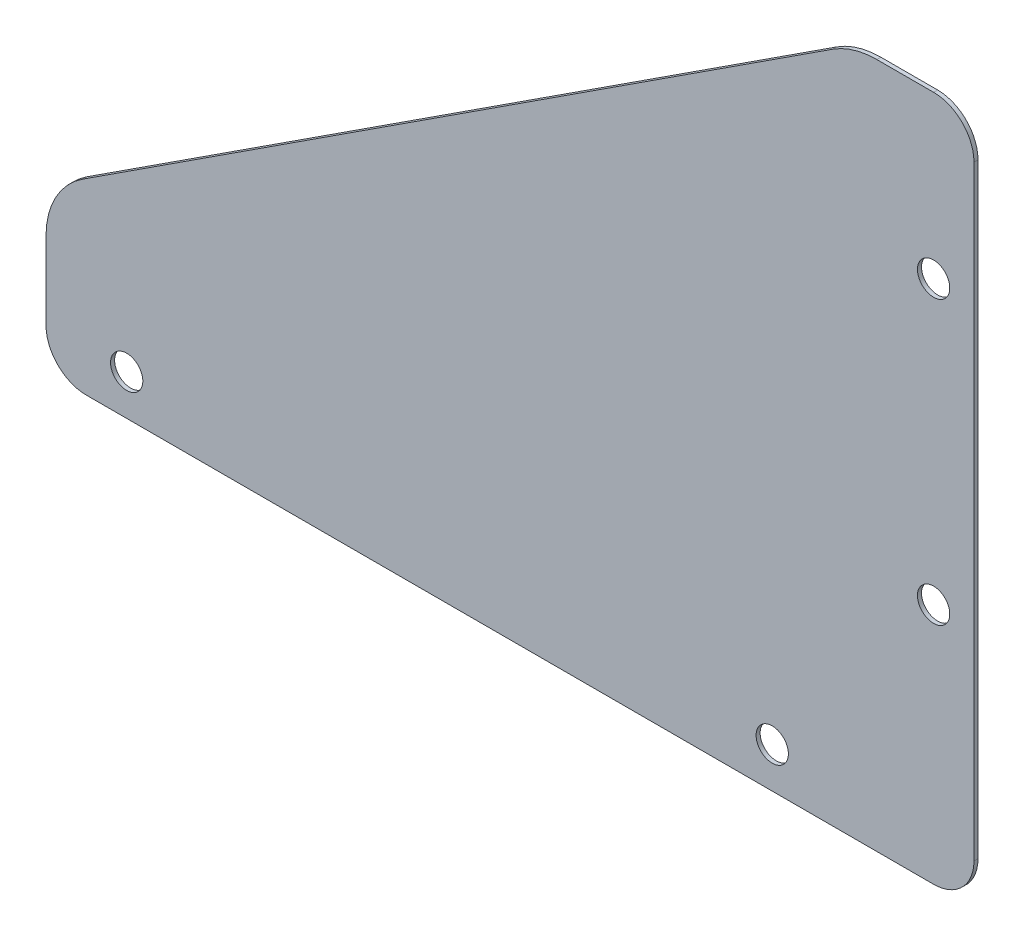
ISO-10303-21;
HEADER;
FILE_DESCRIPTION(('STEP AP214'),'2;1');
FILE_NAME('part.step','',(''),(''),'','','');
FILE_SCHEMA(('AUTOMOTIVE_DESIGN { 1 0 10303 214 1 1 1 1 }'));
ENDSEC;
DATA;
#1=APPLICATION_CONTEXT('core data for automotive mechanical design processes');
#2=APPLICATION_PROTOCOL_DEFINITION('international standard','automotive_design',2000,#1);
#3=PRODUCT_CONTEXT('',#1,'mechanical');
#4=PRODUCT('Part','Part','',(#3));
#5=PRODUCT_RELATED_PRODUCT_CATEGORY('part','',(#4));
#6=PRODUCT_DEFINITION_FORMATION('','',#4);
#7=PRODUCT_DEFINITION_CONTEXT('part definition',#1,'design');
#8=PRODUCT_DEFINITION('design','',#6,#7);
#9=PRODUCT_DEFINITION_SHAPE('','',#8);
#10=(LENGTH_UNIT() NAMED_UNIT(*) SI_UNIT(.MILLI.,.METRE.));
#11=(NAMED_UNIT(*) PLANE_ANGLE_UNIT() SI_UNIT($,.RADIAN.));
#12=(NAMED_UNIT(*) SI_UNIT($,.STERADIAN.) SOLID_ANGLE_UNIT());
#13=UNCERTAINTY_MEASURE_WITH_UNIT(LENGTH_MEASURE(1.E-05),#10,'distance_accuracy_value','');
#14=(GEOMETRIC_REPRESENTATION_CONTEXT(3) GLOBAL_UNCERTAINTY_ASSIGNED_CONTEXT((#13)) GLOBAL_UNIT_ASSIGNED_CONTEXT((#10,
#11,#12)) REPRESENTATION_CONTEXT('',''));
#15=CARTESIAN_POINT('',(0.,0.,0.));
#16=DIRECTION('',(0.,0.,1.));
#17=DIRECTION('',(1.,0.,0.));
#18=AXIS2_PLACEMENT_3D('',#15,#16,#17);
#19=CARTESIAN_POINT('',(-105.,14.5731395581234,0.5));
#20=DIRECTION('',(0.,0.,1.));
#21=DIRECTION('',(1.,0.,0.));
#22=AXIS2_PLACEMENT_3D('',#19,#20,#21);
#23=PLANE('',#22);
#24=CARTESIAN_POINT('',(-25.,5.,0.5));
#25=DIRECTION('',(0.,0.,1.));
#26=DIRECTION('',(1.,0.,0.));
#27=AXIS2_PLACEMENT_3D('',#24,#25,#26);
#28=CIRCLE('',#27,2.);
#29=CARTESIAN_POINT('',(-23.,5.,0.5));
#30=VERTEX_POINT('',#29);
#31=EDGE_CURVE('E220',#30,#30,#28,.T.);
#32=ORIENTED_EDGE('',*,*,#31,.F.);
#33=EDGE_LOOP('',(#32));
#34=FACE_BOUND('',#33,.T.);
#35=CARTESIAN_POINT('',(-105.,5.,0.5));
#36=DIRECTION('',(0.,0.,1.));
#37=DIRECTION('',(1.,0.,0.));
#38=AXIS2_PLACEMENT_3D('',#35,#36,#37);
#39=CIRCLE('',#38,2.);
#40=CARTESIAN_POINT('',(-103.,5.,0.5));
#41=VERTEX_POINT('',#40);
#42=EDGE_CURVE('E148',#41,#41,#39,.T.);
#43=ORIENTED_EDGE('',*,*,#42,.F.);
#44=EDGE_LOOP('',(#43));
#45=FACE_BOUND('',#44,.T.);
#46=CARTESIAN_POINT('',(-105.,14.5731395581234,0.5));
#47=DIRECTION('',(0.,0.,1.));
#48=DIRECTION('',(1.,0.,0.));
#49=AXIS2_PLACEMENT_3D('',#46,#47,#48);
#50=CIRCLE('',#49,9.99999999999999);
#51=CARTESIAN_POINT('',(-110.449883505954,22.9575757211298,0.5));
#52=VERTEX_POINT('',#51);
#53=CARTESIAN_POINT('',(-115.,14.5731395581234,0.5));
#54=VERTEX_POINT('',#53);
#55=EDGE_CURVE('E163',#52,#54,#50,.T.);
#56=ORIENTED_EDGE('',*,*,#55,.T.);
#57=DIRECTION('',(0.,-1.,0.));
#58=VECTOR('',#57,1.);
#59=CARTESIAN_POINT('',(-115.,14.5731395581234,0.5));
#60=LINE('',#59,#58);
#61=CARTESIAN_POINT('',(-115.,5.00000000000004,0.5));
#62=VERTEX_POINT('',#61);
#63=EDGE_CURVE('E101',#54,#62,#60,.T.);
#64=ORIENTED_EDGE('',*,*,#63,.T.);
#65=CARTESIAN_POINT('',(-110.,5.,0.5));
#66=DIRECTION('',(0.,0.,1.));
#67=DIRECTION('',(1.,0.,0.));
#68=AXIS2_PLACEMENT_3D('',#65,#66,#67);
#69=CIRCLE('',#68,5.);
#70=CARTESIAN_POINT('',(-110.,0.,0.5));
#71=VERTEX_POINT('',#70);
#72=EDGE_CURVE('E184',#62,#71,#69,.T.);
#73=ORIENTED_EDGE('',*,*,#72,.T.);
#74=DIRECTION('',(1.,0.,0.));
#75=VECTOR('',#74,1.);
#76=CARTESIAN_POINT('',(-110.,0.,0.5));
#77=LINE('',#76,#75);
#78=CARTESIAN_POINT('',(-5.00000000000003,0.,0.5));
#79=VERTEX_POINT('',#78);
#80=EDGE_CURVE('E203',#71,#79,#77,.T.);
#81=ORIENTED_EDGE('',*,*,#80,.T.);
#82=CARTESIAN_POINT('',(-5.,5.,0.5));
#83=DIRECTION('',(0.,0.,1.));
#84=DIRECTION('',(-1.,0.,0.));
#85=AXIS2_PLACEMENT_3D('',#82,#83,#84);
#86=CIRCLE('',#85,5.);
#87=CARTESIAN_POINT('',(0.,5.00000000000004,0.5));
#88=VERTEX_POINT('',#87);
#89=EDGE_CURVE('E200',#79,#88,#86,.T.);
#90=ORIENTED_EDGE('',*,*,#89,.T.);
#91=DIRECTION('',(0.,1.,0.));
#92=VECTOR('',#91,1.);
#93=CARTESIAN_POINT('',(0.,5.00000000000004,0.5));
#94=LINE('',#93,#92);
#95=CARTESIAN_POINT('',(0.,80.,0.5));
#96=VERTEX_POINT('',#95);
#97=EDGE_CURVE('E202',#88,#96,#94,.T.);
#98=ORIENTED_EDGE('',*,*,#97,.T.);
#99=CARTESIAN_POINT('',(-5.,80.,0.5));
#100=DIRECTION('',(0.,0.,1.));
#101=DIRECTION('',(1.,0.,0.));
#102=AXIS2_PLACEMENT_3D('',#99,#100,#101);
#103=CIRCLE('',#102,5.);
#104=CARTESIAN_POINT('',(-5.00000000000004,85.,0.5));
#105=VERTEX_POINT('',#104);
#106=EDGE_CURVE('E126',#96,#105,#103,.T.);
#107=ORIENTED_EDGE('',*,*,#106,.T.);
#108=DIRECTION('',(-1.,0.,0.));
#109=VECTOR('',#108,1.);
#110=CARTESIAN_POINT('',(-5.00000000000004,85.,0.5));
#111=LINE('',#110,#109);
#112=CARTESIAN_POINT('',(-12.0355993201899,85.,0.5));
#113=VERTEX_POINT('',#112);
#114=EDGE_CURVE('E120',#105,#113,#111,.T.);
#115=ORIENTED_EDGE('',*,*,#114,.T.);
#116=CARTESIAN_POINT('',(-12.0355993201899,75.,0.5));
#117=DIRECTION('',(0.,0.,1.));
#118=DIRECTION('',(1.,0.,0.));
#119=AXIS2_PLACEMENT_3D('',#116,#117,#118);
#120=CIRCLE('',#119,9.99999999999999);
#121=CARTESIAN_POINT('',(-17.4854828261441,83.3844361630064,0.5));
#122=VERTEX_POINT('',#121);
#123=EDGE_CURVE('E124',#113,#122,#120,.T.);
#124=ORIENTED_EDGE('',*,*,#123,.T.);
#125=DIRECTION('',(-0.838443616300637,-0.544988350595414,0.));
#126=VECTOR('',#125,1.);
#127=CARTESIAN_POINT('',(-17.4854828261441,83.3844361630064,0.5));
#128=LINE('',#127,#126);
#129=EDGE_CURVE('E52',#122,#52,#128,.T.);
#130=ORIENTED_EDGE('',*,*,#129,.T.);
#131=EDGE_LOOP('',(#56,#64,#73,#81,#90,#98,#107,#115,#124,#130));
#132=FACE_BOUND('',#131,.T.);
#133=CARTESIAN_POINT('',(-5.,30.,0.5));
#134=DIRECTION('',(0.,0.,1.));
#135=DIRECTION('',(1.,0.,0.));
#136=AXIS2_PLACEMENT_3D('',#133,#134,#135);
#137=CIRCLE('',#136,2.);
#138=CARTESIAN_POINT('',(-3.,30.,0.5));
#139=VERTEX_POINT('',#138);
#140=EDGE_CURVE('E214',#139,#139,#137,.T.);
#141=ORIENTED_EDGE('',*,*,#140,.F.);
#142=EDGE_LOOP('',(#141));
#143=FACE_BOUND('',#142,.T.);
#144=CARTESIAN_POINT('',(-5.00000000000012,65.,0.5));
#145=DIRECTION('',(0.,0.,1.));
#146=DIRECTION('',(1.,0.,0.));
#147=AXIS2_PLACEMENT_3D('',#144,#145,#146);
#148=CIRCLE('',#147,2.);
#149=CARTESIAN_POINT('',(-3.00000000000012,65.,0.5));
#150=VERTEX_POINT('',#149);
#151=EDGE_CURVE('E226',#150,#150,#148,.T.);
#152=ORIENTED_EDGE('',*,*,#151,.F.);
#153=EDGE_LOOP('',(#152));
#154=FACE_BOUND('',#153,.T.);
#155=ADVANCED_FACE('F35',(#34,#45,#132,#143,#154),#23,.T.);
#156=CARTESIAN_POINT('',(-105.,14.5731395581234,0.));
#157=DIRECTION('',(0.,0.,1.));
#158=DIRECTION('',(1.,0.,0.));
#159=AXIS2_PLACEMENT_3D('',#156,#157,#158);
#160=PLANE('',#159);
#161=CARTESIAN_POINT('',(-25.,5.,0.));
#162=DIRECTION('',(0.,0.,1.));
#163=DIRECTION('',(1.,0.,0.));
#164=AXIS2_PLACEMENT_3D('',#161,#162,#163);
#165=CIRCLE('',#164,2.);
#166=CARTESIAN_POINT('',(-23.,5.,0.));
#167=VERTEX_POINT('',#166);
#168=EDGE_CURVE('E223',#167,#167,#165,.T.);
#169=ORIENTED_EDGE('',*,*,#168,.T.);
#170=EDGE_LOOP('',(#169));
#171=FACE_BOUND('',#170,.T.);
#172=CARTESIAN_POINT('',(-105.,5.,0.));
#173=DIRECTION('',(0.,0.,1.));
#174=DIRECTION('',(1.,0.,0.));
#175=AXIS2_PLACEMENT_3D('',#172,#173,#174);
#176=CIRCLE('',#175,2.);
#177=CARTESIAN_POINT('',(-103.,5.,0.));
#178=VERTEX_POINT('',#177);
#179=EDGE_CURVE('E211',#178,#178,#176,.T.);
#180=ORIENTED_EDGE('',*,*,#179,.T.);
#181=EDGE_LOOP('',(#180));
#182=FACE_BOUND('',#181,.T.);
#183=CARTESIAN_POINT('',(-105.,14.5731395581234,0.));
#184=DIRECTION('',(0.,0.,1.));
#185=DIRECTION('',(1.,0.,0.));
#186=AXIS2_PLACEMENT_3D('',#183,#184,#185);
#187=CIRCLE('',#186,9.99999999999999);
#188=CARTESIAN_POINT('',(-110.449883505954,22.9575757211298,0.));
#189=VERTEX_POINT('',#188);
#190=CARTESIAN_POINT('',(-115.,14.5731395581234,0.));
#191=VERTEX_POINT('',#190);
#192=EDGE_CURVE('E144',#189,#191,#187,.T.);
#193=ORIENTED_EDGE('',*,*,#192,.F.);
#194=DIRECTION('',(-0.838443616300637,-0.544988350595414,0.));
#195=VECTOR('',#194,1.);
#196=CARTESIAN_POINT('',(-17.4854828261441,83.3844361630064,0.));
#197=LINE('',#196,#195);
#198=CARTESIAN_POINT('',(-17.4854828261441,83.3844361630064,0.));
#199=VERTEX_POINT('',#198);
#200=EDGE_CURVE('E93',#199,#189,#197,.T.);
#201=ORIENTED_EDGE('',*,*,#200,.F.);
#202=CARTESIAN_POINT('',(-12.0355993201899,75.,0.));
#203=DIRECTION('',(0.,0.,1.));
#204=DIRECTION('',(1.,0.,0.));
#205=AXIS2_PLACEMENT_3D('',#202,#203,#204);
#206=CIRCLE('',#205,9.99999999999999);
#207=CARTESIAN_POINT('',(-12.0355993201899,85.,0.));
#208=VERTEX_POINT('',#207);
#209=EDGE_CURVE('E87',#208,#199,#206,.T.);
#210=ORIENTED_EDGE('',*,*,#209,.F.);
#211=DIRECTION('',(-1.,0.,0.));
#212=VECTOR('',#211,1.);
#213=CARTESIAN_POINT('',(-5.00000000000004,85.,0.));
#214=LINE('',#213,#212);
#215=CARTESIAN_POINT('',(-5.00000000000004,85.,0.));
#216=VERTEX_POINT('',#215);
#217=EDGE_CURVE('E134',#216,#208,#214,.T.);
#218=ORIENTED_EDGE('',*,*,#217,.F.);
#219=CARTESIAN_POINT('',(-5.,80.,0.));
#220=DIRECTION('',(0.,0.,1.));
#221=DIRECTION('',(1.,0.,0.));
#222=AXIS2_PLACEMENT_3D('',#219,#220,#221);
#223=CIRCLE('',#222,5.);
#224=CARTESIAN_POINT('',(0.,80.,0.));
#225=VERTEX_POINT('',#224);
#226=EDGE_CURVE('E158',#225,#216,#223,.T.);
#227=ORIENTED_EDGE('',*,*,#226,.F.);
#228=DIRECTION('',(0.,1.,0.));
#229=VECTOR('',#228,1.);
#230=CARTESIAN_POINT('',(0.,5.00000000000004,0.));
#231=LINE('',#230,#229);
#232=CARTESIAN_POINT('',(0.,5.00000000000004,0.));
#233=VERTEX_POINT('',#232);
#234=EDGE_CURVE('E156',#233,#225,#231,.T.);
#235=ORIENTED_EDGE('',*,*,#234,.F.);
#236=CARTESIAN_POINT('',(-5.,5.,0.));
#237=DIRECTION('',(0.,0.,1.));
#238=DIRECTION('',(-1.,0.,0.));
#239=AXIS2_PLACEMENT_3D('',#236,#237,#238);
#240=CIRCLE('',#239,5.);
#241=CARTESIAN_POINT('',(-5.00000000000003,0.,0.));
#242=VERTEX_POINT('',#241);
#243=EDGE_CURVE('E154',#242,#233,#240,.T.);
#244=ORIENTED_EDGE('',*,*,#243,.F.);
#245=DIRECTION('',(1.,0.,0.));
#246=VECTOR('',#245,1.);
#247=CARTESIAN_POINT('',(-110.,0.,0.));
#248=LINE('',#247,#246);
#249=CARTESIAN_POINT('',(-110.,0.,0.));
#250=VERTEX_POINT('',#249);
#251=EDGE_CURVE('E152',#250,#242,#248,.T.);
#252=ORIENTED_EDGE('',*,*,#251,.F.);
#253=CARTESIAN_POINT('',(-110.,5.,0.));
#254=DIRECTION('',(0.,0.,1.));
#255=DIRECTION('',(1.,0.,0.));
#256=AXIS2_PLACEMENT_3D('',#253,#254,#255);
#257=CIRCLE('',#256,5.);
#258=CARTESIAN_POINT('',(-115.,5.00000000000004,0.));
#259=VERTEX_POINT('',#258);
#260=EDGE_CURVE('E150',#259,#250,#257,.T.);
#261=ORIENTED_EDGE('',*,*,#260,.F.);
#262=DIRECTION('',(0.,-1.,0.));
#263=VECTOR('',#262,1.);
#264=CARTESIAN_POINT('',(-115.,14.5731395581234,0.));
#265=LINE('',#264,#263);
#266=EDGE_CURVE('E147',#191,#259,#265,.T.);
#267=ORIENTED_EDGE('',*,*,#266,.F.);
#268=EDGE_LOOP('',(#193,#201,#210,#218,#227,#235,#244,#252,#261,#267));
#269=FACE_BOUND('',#268,.T.);
#270=CARTESIAN_POINT('',(-5.,30.,0.));
#271=DIRECTION('',(0.,0.,1.));
#272=DIRECTION('',(1.,0.,0.));
#273=AXIS2_PLACEMENT_3D('',#270,#271,#272);
#274=CIRCLE('',#273,2.);
#275=CARTESIAN_POINT('',(-3.,30.,0.));
#276=VERTEX_POINT('',#275);
#277=EDGE_CURVE('E217',#276,#276,#274,.T.);
#278=ORIENTED_EDGE('',*,*,#277,.T.);
#279=EDGE_LOOP('',(#278));
#280=FACE_BOUND('',#279,.T.);
#281=CARTESIAN_POINT('',(-5.00000000000012,65.,0.));
#282=DIRECTION('',(0.,0.,1.));
#283=DIRECTION('',(1.,0.,0.));
#284=AXIS2_PLACEMENT_3D('',#281,#282,#283);
#285=CIRCLE('',#284,2.);
#286=CARTESIAN_POINT('',(-3.00000000000012,65.,0.));
#287=VERTEX_POINT('',#286);
#288=EDGE_CURVE('E229',#287,#287,#285,.T.);
#289=ORIENTED_EDGE('',*,*,#288,.T.);
#290=EDGE_LOOP('',(#289));
#291=FACE_BOUND('',#290,.T.);
#292=ADVANCED_FACE('F188',(#171,#182,#269,#280,#291),#160,.F.);
#293=CARTESIAN_POINT('',(-105.,14.5731395581234,0.5));
#294=DIRECTION('',(0.,0.,-1.));
#295=DIRECTION('',(-1.,0.,0.));
#296=AXIS2_PLACEMENT_3D('',#293,#294,#295);
#297=CYLINDRICAL_SURFACE('',#296,9.99999999999999);
#298=ORIENTED_EDGE('',*,*,#192,.T.);
#299=DIRECTION('',(0.,0.,-1.));
#300=VECTOR('',#299,1.);
#301=CARTESIAN_POINT('',(-115.,14.5731395581234,0.5));
#302=LINE('',#301,#300);
#303=EDGE_CURVE('E11',#54,#191,#302,.T.);
#304=ORIENTED_EDGE('',*,*,#303,.F.);
#305=ORIENTED_EDGE('',*,*,#55,.F.);
#306=DIRECTION('',(0.,0.,-1.));
#307=VECTOR('',#306,1.);
#308=CARTESIAN_POINT('',(-110.449883505954,22.9575757211298,0.5));
#309=LINE('',#308,#307);
#310=EDGE_CURVE('E140',#52,#189,#309,.T.);
#311=ORIENTED_EDGE('',*,*,#310,.T.);
#312=EDGE_LOOP('',(#298,#304,#305,#311));
#313=FACE_BOUND('',#312,.T.);
#314=ADVANCED_FACE('F37',(#313),#297,.T.);
#315=CARTESIAN_POINT('',(-115.,14.5731395581234,0.5));
#316=DIRECTION('',(1.,0.,0.));
#317=DIRECTION('',(0.,0.,-1.));
#318=AXIS2_PLACEMENT_3D('',#315,#316,#317);
#319=PLANE('',#318);
#320=ORIENTED_EDGE('',*,*,#266,.T.);
#321=DIRECTION('',(0.,0.,-1.));
#322=VECTOR('',#321,1.);
#323=CARTESIAN_POINT('',(-115.,5.00000000000004,0.5));
#324=LINE('',#323,#322);
#325=EDGE_CURVE('E44',#62,#259,#324,.T.);
#326=ORIENTED_EDGE('',*,*,#325,.F.);
#327=ORIENTED_EDGE('',*,*,#63,.F.);
#328=ORIENTED_EDGE('',*,*,#303,.T.);
#329=EDGE_LOOP('',(#320,#326,#327,#328));
#330=FACE_BOUND('',#329,.T.);
#331=ADVANCED_FACE('F272',(#330),#319,.F.);
#332=CARTESIAN_POINT('',(-110.,5.,0.5));
#333=DIRECTION('',(0.,0.,-1.));
#334=DIRECTION('',(-1.,0.,0.));
#335=AXIS2_PLACEMENT_3D('',#332,#333,#334);
#336=CYLINDRICAL_SURFACE('',#335,5.);
#337=ORIENTED_EDGE('',*,*,#260,.T.);
#338=DIRECTION('',(0.,0.,-1.));
#339=VECTOR('',#338,1.);
#340=CARTESIAN_POINT('',(-110.,0.,0.5));
#341=LINE('',#340,#339);
#342=EDGE_CURVE('E176',#71,#250,#341,.T.);
#343=ORIENTED_EDGE('',*,*,#342,.F.);
#344=ORIENTED_EDGE('',*,*,#72,.F.);
#345=ORIENTED_EDGE('',*,*,#325,.T.);
#346=EDGE_LOOP('',(#337,#343,#344,#345));
#347=FACE_BOUND('',#346,.T.);
#348=ADVANCED_FACE('F182',(#347),#336,.T.);
#349=CARTESIAN_POINT('',(-110.,0.,0.5));
#350=DIRECTION('',(0.,1.,0.));
#351=DIRECTION('',(0.,0.,1.));
#352=AXIS2_PLACEMENT_3D('',#349,#350,#351);
#353=PLANE('',#352);
#354=ORIENTED_EDGE('',*,*,#251,.T.);
#355=DIRECTION('',(0.,0.,-1.));
#356=VECTOR('',#355,1.);
#357=CARTESIAN_POINT('',(-5.00000000000003,0.,0.5));
#358=LINE('',#357,#356);
#359=EDGE_CURVE('E173',#79,#242,#358,.T.);
#360=ORIENTED_EDGE('',*,*,#359,.F.);
#361=ORIENTED_EDGE('',*,*,#80,.F.);
#362=ORIENTED_EDGE('',*,*,#342,.T.);
#363=EDGE_LOOP('',(#354,#360,#361,#362));
#364=FACE_BOUND('',#363,.T.);
#365=ADVANCED_FACE('F194',(#364),#353,.F.);
#366=CARTESIAN_POINT('',(-5.,5.,0.5));
#367=DIRECTION('',(0.,0.,-1.));
#368=DIRECTION('',(-1.,0.,0.));
#369=AXIS2_PLACEMENT_3D('',#366,#367,#368);
#370=CYLINDRICAL_SURFACE('',#369,5.);
#371=ORIENTED_EDGE('',*,*,#243,.T.);
#372=DIRECTION('',(0.,0.,-1.));
#373=VECTOR('',#372,1.);
#374=CARTESIAN_POINT('',(0.,5.00000000000004,0.5));
#375=LINE('',#374,#373);
#376=EDGE_CURVE('E170',#88,#233,#375,.T.);
#377=ORIENTED_EDGE('',*,*,#376,.F.);
#378=ORIENTED_EDGE('',*,*,#89,.F.);
#379=ORIENTED_EDGE('',*,*,#359,.T.);
#380=EDGE_LOOP('',(#371,#377,#378,#379));
#381=FACE_BOUND('',#380,.T.);
#382=ADVANCED_FACE('F198',(#381),#370,.T.);
#383=CARTESIAN_POINT('',(0.,5.00000000000004,0.5));
#384=DIRECTION('',(-1.,0.,0.));
#385=DIRECTION('',(0.,0.,1.));
#386=AXIS2_PLACEMENT_3D('',#383,#384,#385);
#387=PLANE('',#386);
#388=ORIENTED_EDGE('',*,*,#234,.T.);
#389=DIRECTION('',(0.,0.,-1.));
#390=VECTOR('',#389,1.);
#391=CARTESIAN_POINT('',(0.,80.,0.5));
#392=LINE('',#391,#390);
#393=EDGE_CURVE('E167',#96,#225,#392,.T.);
#394=ORIENTED_EDGE('',*,*,#393,.F.);
#395=ORIENTED_EDGE('',*,*,#97,.F.);
#396=ORIENTED_EDGE('',*,*,#376,.T.);
#397=EDGE_LOOP('',(#388,#394,#395,#396));
#398=FACE_BOUND('',#397,.T.);
#399=ADVANCED_FACE('F262',(#398),#387,.F.);
#400=CARTESIAN_POINT('',(-5.,80.,0.5));
#401=DIRECTION('',(0.,0.,-1.));
#402=DIRECTION('',(-1.,0.,0.));
#403=AXIS2_PLACEMENT_3D('',#400,#401,#402);
#404=CYLINDRICAL_SURFACE('',#403,5.);
#405=ORIENTED_EDGE('',*,*,#226,.T.);
#406=DIRECTION('',(0.,0.,-1.));
#407=VECTOR('',#406,1.);
#408=CARTESIAN_POINT('',(-5.00000000000004,85.,0.5));
#409=LINE('',#408,#407);
#410=EDGE_CURVE('E135',#105,#216,#409,.T.);
#411=ORIENTED_EDGE('',*,*,#410,.F.);
#412=ORIENTED_EDGE('',*,*,#106,.F.);
#413=ORIENTED_EDGE('',*,*,#393,.T.);
#414=EDGE_LOOP('',(#405,#411,#412,#413));
#415=FACE_BOUND('',#414,.T.);
#416=ADVANCED_FACE('F259',(#415),#404,.T.);
#417=CARTESIAN_POINT('',(-5.00000000000004,85.,0.5));
#418=DIRECTION('',(0.,-1.,0.));
#419=DIRECTION('',(0.,0.,-1.));
#420=AXIS2_PLACEMENT_3D('',#417,#418,#419);
#421=PLANE('',#420);
#422=ORIENTED_EDGE('',*,*,#217,.T.);
#423=DIRECTION('',(0.,0.,-1.));
#424=VECTOR('',#423,1.);
#425=CARTESIAN_POINT('',(-12.0355993201899,85.,0.5));
#426=LINE('',#425,#424);
#427=EDGE_CURVE('E131',#113,#208,#426,.T.);
#428=ORIENTED_EDGE('',*,*,#427,.F.);
#429=ORIENTED_EDGE('',*,*,#114,.F.);
#430=ORIENTED_EDGE('',*,*,#410,.T.);
#431=EDGE_LOOP('',(#422,#428,#429,#430));
#432=FACE_BOUND('',#431,.T.);
#433=ADVANCED_FACE('F132',(#432),#421,.F.);
#434=CARTESIAN_POINT('',(-12.0355993201899,75.,0.5));
#435=DIRECTION('',(0.,0.,-1.));
#436=DIRECTION('',(-1.,0.,0.));
#437=AXIS2_PLACEMENT_3D('',#434,#435,#436);
#438=CYLINDRICAL_SURFACE('',#437,9.99999999999999);
#439=ORIENTED_EDGE('',*,*,#209,.T.);
#440=DIRECTION('',(0.,0.,-1.));
#441=VECTOR('',#440,1.);
#442=CARTESIAN_POINT('',(-17.4854828261441,83.3844361630064,0.5));
#443=LINE('',#442,#441);
#444=EDGE_CURVE('E136',#122,#199,#443,.T.);
#445=ORIENTED_EDGE('',*,*,#444,.F.);
#446=ORIENTED_EDGE('',*,*,#123,.F.);
#447=ORIENTED_EDGE('',*,*,#427,.T.);
#448=EDGE_LOOP('',(#439,#445,#446,#447));
#449=FACE_BOUND('',#448,.T.);
#450=ADVANCED_FACE('F138',(#449),#438,.T.);
#451=CARTESIAN_POINT('',(-17.4854828261441,83.3844361630064,0.5));
#452=DIRECTION('',(0.544988350595414,-0.838443616300637,0.));
#453=DIRECTION('',(0.838443616300637,0.544988350595414,0.));
#454=AXIS2_PLACEMENT_3D('',#451,#452,#453);
#455=PLANE('',#454);
#456=ORIENTED_EDGE('',*,*,#200,.T.);
#457=ORIENTED_EDGE('',*,*,#310,.F.);
#458=ORIENTED_EDGE('',*,*,#129,.F.);
#459=ORIENTED_EDGE('',*,*,#444,.T.);
#460=EDGE_LOOP('',(#456,#457,#458,#459));
#461=FACE_BOUND('',#460,.T.);
#462=ADVANCED_FACE('F252',(#461),#455,.F.);
#463=CARTESIAN_POINT('',(-105.,5.,0.5));
#464=DIRECTION('',(0.,0.,-1.));
#465=DIRECTION('',(-1.,0.,0.));
#466=AXIS2_PLACEMENT_3D('',#463,#464,#465);
#467=CYLINDRICAL_SURFACE('',#466,2.);
#468=ORIENTED_EDGE('',*,*,#42,.T.);
#469=EDGE_LOOP('',(#468));
#470=FACE_BOUND('',#469,.T.);
#471=ORIENTED_EDGE('',*,*,#179,.F.);
#472=EDGE_LOOP('',(#471));
#473=FACE_BOUND('',#472,.T.);
#474=ADVANCED_FACE('F249',(#470,#473),#467,.F.);
#475=CARTESIAN_POINT('',(-5.,30.,0.5));
#476=DIRECTION('',(0.,0.,-1.));
#477=DIRECTION('',(-1.,0.,0.));
#478=AXIS2_PLACEMENT_3D('',#475,#476,#477);
#479=CYLINDRICAL_SURFACE('',#478,2.);
#480=ORIENTED_EDGE('',*,*,#140,.T.);
#481=EDGE_LOOP('',(#480));
#482=FACE_BOUND('',#481,.T.);
#483=ORIENTED_EDGE('',*,*,#277,.F.);
#484=EDGE_LOOP('',(#483));
#485=FACE_BOUND('',#484,.T.);
#486=ADVANCED_FACE('F348',(#482,#485),#479,.F.);
#487=CARTESIAN_POINT('',(-25.,5.,0.5));
#488=DIRECTION('',(0.,0.,-1.));
#489=DIRECTION('',(-1.,0.,0.));
#490=AXIS2_PLACEMENT_3D('',#487,#488,#489);
#491=CYLINDRICAL_SURFACE('',#490,2.);
#492=ORIENTED_EDGE('',*,*,#31,.T.);
#493=EDGE_LOOP('',(#492));
#494=FACE_BOUND('',#493,.T.);
#495=ORIENTED_EDGE('',*,*,#168,.F.);
#496=EDGE_LOOP('',(#495));
#497=FACE_BOUND('',#496,.T.);
#498=ADVANCED_FACE('F356',(#494,#497),#491,.F.);
#499=CARTESIAN_POINT('',(-5.00000000000012,65.,0.5));
#500=DIRECTION('',(0.,0.,-1.));
#501=DIRECTION('',(-1.,0.,0.));
#502=AXIS2_PLACEMENT_3D('',#499,#500,#501);
#503=CYLINDRICAL_SURFACE('',#502,2.);
#504=ORIENTED_EDGE('',*,*,#151,.T.);
#505=EDGE_LOOP('',(#504));
#506=FACE_BOUND('',#505,.T.);
#507=ORIENTED_EDGE('',*,*,#288,.F.);
#508=EDGE_LOOP('',(#507));
#509=FACE_BOUND('',#508,.T.);
#510=ADVANCED_FACE('F235',(#506,#509),#503,.F.);
#511=CLOSED_SHELL('',(#155,#292,#314,#331,#348,#365,#382,#399,#416,#433,#450,#462,#474,#486,
#498,#510));
#512=MANIFOLD_SOLID_BREP('B2',#511);
#513=ADVANCED_BREP_SHAPE_REPRESENTATION('',(#18,#512),#14);
#514=SHAPE_DEFINITION_REPRESENTATION(#9,#513);
ENDSEC;
END-ISO-10303-21;
